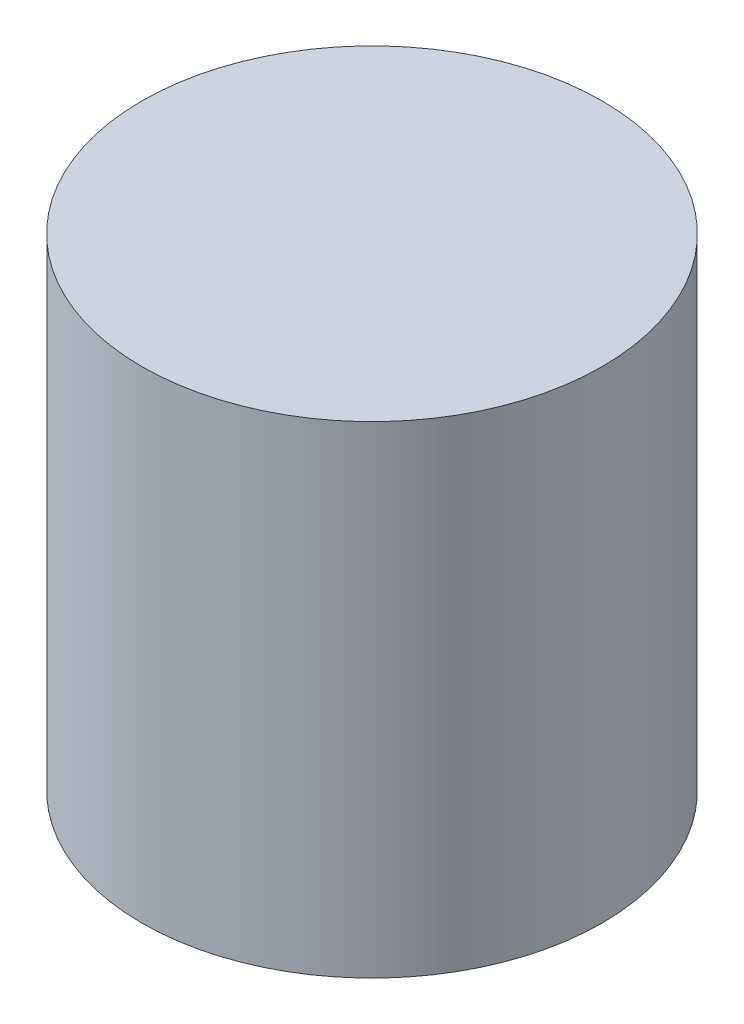
ISO-10303-21;
HEADER;
FILE_DESCRIPTION(('STEP AP214'),'2;1');
FILE_NAME('part.step','',(''),(''),'','','');
FILE_SCHEMA(('AUTOMOTIVE_DESIGN { 1 0 10303 214 1 1 1 1 }'));
ENDSEC;
DATA;
#1=APPLICATION_CONTEXT('core data for automotive mechanical design processes');
#2=APPLICATION_PROTOCOL_DEFINITION('international standard','automotive_design',2000,#1);
#3=PRODUCT_CONTEXT('',#1,'mechanical');
#4=PRODUCT('Part','Part','',(#3));
#5=PRODUCT_RELATED_PRODUCT_CATEGORY('part','',(#4));
#6=PRODUCT_DEFINITION_FORMATION('','',#4);
#7=PRODUCT_DEFINITION_CONTEXT('part definition',#1,'design');
#8=PRODUCT_DEFINITION('design','',#6,#7);
#9=PRODUCT_DEFINITION_SHAPE('','',#8);
#10=(LENGTH_UNIT() NAMED_UNIT(*) SI_UNIT(.MILLI.,.METRE.));
#11=(NAMED_UNIT(*) PLANE_ANGLE_UNIT() SI_UNIT($,.RADIAN.));
#12=(NAMED_UNIT(*) SI_UNIT($,.STERADIAN.) SOLID_ANGLE_UNIT());
#13=UNCERTAINTY_MEASURE_WITH_UNIT(LENGTH_MEASURE(1.E-05),#10,'distance_accuracy_value','');
#14=(GEOMETRIC_REPRESENTATION_CONTEXT(3) GLOBAL_UNCERTAINTY_ASSIGNED_CONTEXT((#13)) GLOBAL_UNIT_ASSIGNED_CONTEXT((#10,
#11,#12)) REPRESENTATION_CONTEXT('',''));
#15=CARTESIAN_POINT('',(0.,0.,0.));
#16=DIRECTION('',(0.,0.,1.));
#17=DIRECTION('',(1.,0.,0.));
#18=AXIS2_PLACEMENT_3D('',#15,#16,#17);
#19=CARTESIAN_POINT('',(0.,5.,0.));
#20=DIRECTION('',(0.,-1.,0.));
#21=DIRECTION('',(0.,0.,-1.));
#22=AXIS2_PLACEMENT_3D('',#19,#20,#21);
#23=CYLINDRICAL_SURFACE('',#22,4.775);
#24=CARTESIAN_POINT('',(0.,5.,0.));
#25=DIRECTION('',(0.,1.,0.));
#26=DIRECTION('',(0.,0.,1.));
#27=AXIS2_PLACEMENT_3D('',#24,#25,#26);
#28=CIRCLE('',#27,4.775);
#29=CARTESIAN_POINT('',(0.,5.,4.775));
#30=VERTEX_POINT('',#29);
#31=EDGE_CURVE('E10',#30,#30,#28,.T.);
#32=ORIENTED_EDGE('',*,*,#31,.F.);
#33=EDGE_LOOP('',(#32));
#34=FACE_BOUND('',#33,.T.);
#35=CARTESIAN_POINT('',(0.,-5.,0.));
#36=DIRECTION('',(0.,1.,0.));
#37=DIRECTION('',(0.,0.,1.));
#38=AXIS2_PLACEMENT_3D('',#35,#36,#37);
#39=CIRCLE('',#38,4.775);
#40=CARTESIAN_POINT('',(0.,-5.,4.775));
#41=VERTEX_POINT('',#40);
#42=EDGE_CURVE('E36',#41,#41,#39,.T.);
#43=ORIENTED_EDGE('',*,*,#42,.T.);
#44=EDGE_LOOP('',(#43));
#45=FACE_BOUND('',#44,.T.);
#46=ADVANCED_FACE('F33',(#34,#45),#23,.T.);
#47=CARTESIAN_POINT('',(0.,5.,0.));
#48=DIRECTION('',(0.,1.,0.));
#49=DIRECTION('',(0.,0.,1.));
#50=AXIS2_PLACEMENT_3D('',#47,#48,#49);
#51=PLANE('',#50);
#52=ORIENTED_EDGE('',*,*,#31,.T.);
#53=EDGE_LOOP('',(#52));
#54=FACE_BOUND('',#53,.T.);
#55=ADVANCED_FACE('F48',(#54),#51,.T.);
#56=CARTESIAN_POINT('',(0.,-5.,0.));
#57=DIRECTION('',(0.,1.,0.));
#58=DIRECTION('',(0.,0.,1.));
#59=AXIS2_PLACEMENT_3D('',#56,#57,#58);
#60=PLANE('',#59);
#61=ORIENTED_EDGE('',*,*,#42,.F.);
#62=EDGE_LOOP('',(#61));
#63=FACE_BOUND('',#62,.T.);
#64=ADVANCED_FACE('F46',(#63),#60,.F.);
#65=CLOSED_SHELL('',(#46,#55,#64));
#66=MANIFOLD_SOLID_BREP('B2',#65);
#67=ADVANCED_BREP_SHAPE_REPRESENTATION('',(#18,#66),#14);
#68=SHAPE_DEFINITION_REPRESENTATION(#9,#67);
ENDSEC;
END-ISO-10303-21;
